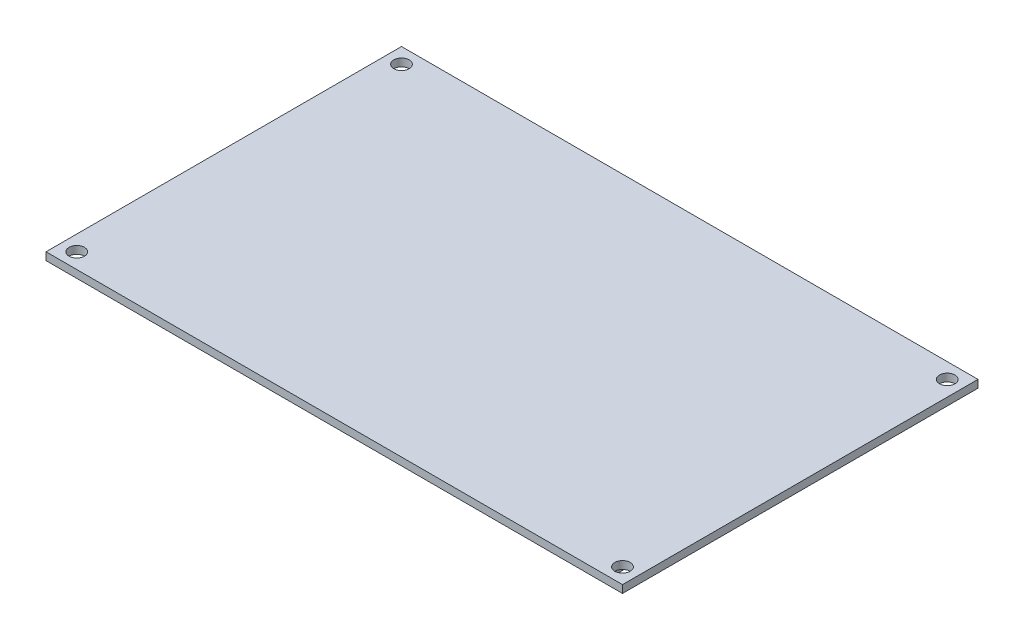
ISO-10303-21;
HEADER;
FILE_DESCRIPTION(('STEP AP214'),'2;1');
FILE_NAME('part.step','',(''),(''),'','','');
FILE_SCHEMA(('AUTOMOTIVE_DESIGN { 1 0 10303 214 1 1 1 1 }'));
ENDSEC;
DATA;
#1=APPLICATION_CONTEXT('core data for automotive mechanical design processes');
#2=APPLICATION_PROTOCOL_DEFINITION('international standard','automotive_design',2000,#1);
#3=PRODUCT_CONTEXT('',#1,'mechanical');
#4=PRODUCT('Part','Part','',(#3));
#5=PRODUCT_RELATED_PRODUCT_CATEGORY('part','',(#4));
#6=PRODUCT_DEFINITION_FORMATION('','',#4);
#7=PRODUCT_DEFINITION_CONTEXT('part definition',#1,'design');
#8=PRODUCT_DEFINITION('design','',#6,#7);
#9=PRODUCT_DEFINITION_SHAPE('','',#8);
#10=(LENGTH_UNIT() NAMED_UNIT(*) SI_UNIT(.MILLI.,.METRE.));
#11=(NAMED_UNIT(*) PLANE_ANGLE_UNIT() SI_UNIT($,.RADIAN.));
#12=(NAMED_UNIT(*) SI_UNIT($,.STERADIAN.) SOLID_ANGLE_UNIT());
#13=UNCERTAINTY_MEASURE_WITH_UNIT(LENGTH_MEASURE(1.E-05),#10,'distance_accuracy_value','');
#14=(GEOMETRIC_REPRESENTATION_CONTEXT(3) GLOBAL_UNCERTAINTY_ASSIGNED_CONTEXT((#13)) GLOBAL_UNIT_ASSIGNED_CONTEXT((#10,
#11,#12)) REPRESENTATION_CONTEXT('',''));
#15=CARTESIAN_POINT('',(0.,0.,0.));
#16=DIRECTION('',(0.,0.,1.));
#17=DIRECTION('',(1.,0.,0.));
#18=AXIS2_PLACEMENT_3D('',#15,#16,#17);
#19=CARTESIAN_POINT('',(0.,0.,0.));
#20=DIRECTION('',(0.,1.,0.));
#21=DIRECTION('',(0.,0.,1.));
#22=AXIS2_PLACEMENT_3D('',#19,#20,#21);
#23=PLANE('',#22);
#24=CARTESIAN_POINT('',(56.8,0.,-33.8));
#25=DIRECTION('',(0.,1.,0.));
#26=DIRECTION('',(0.,0.,-1.));
#27=AXIS2_PLACEMENT_3D('',#24,#25,#26);
#28=CIRCLE('',#27,1.6);
#29=CARTESIAN_POINT('',(56.8,0.,-35.4));
#30=VERTEX_POINT('',#29);
#31=EDGE_CURVE('E119',#30,#30,#28,.T.);
#32=ORIENTED_EDGE('',*,*,#31,.T.);
#33=EDGE_LOOP('',(#32));
#34=FACE_BOUND('',#33,.T.);
#35=CARTESIAN_POINT('',(56.8,0.,33.8));
#36=DIRECTION('',(0.,1.,0.));
#37=DIRECTION('',(0.,0.,1.));
#38=AXIS2_PLACEMENT_3D('',#35,#36,#37);
#39=CIRCLE('',#38,1.6);
#40=CARTESIAN_POINT('',(56.8,0.,35.4));
#41=VERTEX_POINT('',#40);
#42=EDGE_CURVE('E129',#41,#41,#39,.T.);
#43=ORIENTED_EDGE('',*,*,#42,.T.);
#44=EDGE_LOOP('',(#43));
#45=FACE_BOUND('',#44,.T.);
#46=CARTESIAN_POINT('',(-56.8,0.,33.8));
#47=DIRECTION('',(0.,1.,0.));
#48=DIRECTION('',(0.,0.,-1.));
#49=AXIS2_PLACEMENT_3D('',#46,#47,#48);
#50=CIRCLE('',#49,1.6);
#51=CARTESIAN_POINT('',(-56.8,0.,32.2));
#52=VERTEX_POINT('',#51);
#53=EDGE_CURVE('E134',#52,#52,#50,.T.);
#54=ORIENTED_EDGE('',*,*,#53,.T.);
#55=EDGE_LOOP('',(#54));
#56=FACE_BOUND('',#55,.T.);
#57=CARTESIAN_POINT('',(-56.8,0.,-33.8));
#58=DIRECTION('',(0.,1.,0.));
#59=DIRECTION('',(0.,0.,1.));
#60=AXIS2_PLACEMENT_3D('',#57,#58,#59);
#61=CIRCLE('',#60,1.6);
#62=CARTESIAN_POINT('',(-56.8,0.,-32.2));
#63=VERTEX_POINT('',#62);
#64=EDGE_CURVE('E140',#63,#63,#61,.T.);
#65=ORIENTED_EDGE('',*,*,#64,.T.);
#66=EDGE_LOOP('',(#65));
#67=FACE_BOUND('',#66,.T.);
#68=DIRECTION('',(0.,0.,-1.));
#69=VECTOR('',#68,1.);
#70=CARTESIAN_POINT('',(60.,0.,-37.));
#71=LINE('',#70,#69);
#72=CARTESIAN_POINT('',(60.,0.,37.));
#73=VERTEX_POINT('',#72);
#74=CARTESIAN_POINT('',(60.,0.,-37.));
#75=VERTEX_POINT('',#74);
#76=EDGE_CURVE('E146',#73,#75,#71,.T.);
#77=ORIENTED_EDGE('',*,*,#76,.F.);
#78=DIRECTION('',(1.,0.,0.));
#79=VECTOR('',#78,1.);
#80=CARTESIAN_POINT('',(-60.,0.,37.));
#81=LINE('',#80,#79);
#82=CARTESIAN_POINT('',(-60.,0.,37.));
#83=VERTEX_POINT('',#82);
#84=EDGE_CURVE('E153',#83,#73,#81,.T.);
#85=ORIENTED_EDGE('',*,*,#84,.F.);
#86=DIRECTION('',(0.,0.,1.));
#87=VECTOR('',#86,1.);
#88=CARTESIAN_POINT('',(-60.,0.,-37.));
#89=LINE('',#88,#87);
#90=CARTESIAN_POINT('',(-60.,0.,-37.));
#91=VERTEX_POINT('',#90);
#92=EDGE_CURVE('E164',#91,#83,#89,.T.);
#93=ORIENTED_EDGE('',*,*,#92,.F.);
#94=DIRECTION('',(-1.,0.,0.));
#95=VECTOR('',#94,1.);
#96=CARTESIAN_POINT('',(-60.,0.,-37.));
#97=LINE('',#96,#95);
#98=EDGE_CURVE('E162',#75,#91,#97,.T.);
#99=ORIENTED_EDGE('',*,*,#98,.F.);
#100=EDGE_LOOP('',(#77,#85,#93,#99));
#101=FACE_BOUND('',#100,.T.);
#102=DIRECTION('',(0.,0.,-1.));
#103=VECTOR('',#102,1.);
#104=CARTESIAN_POINT('',(-52.75,0.,-33.6));
#105=LINE('',#104,#103);
#106=CARTESIAN_POINT('',(-52.75,0.,33.6));
#107=VERTEX_POINT('',#106);
#108=CARTESIAN_POINT('',(-52.75,0.,-33.6));
#109=VERTEX_POINT('',#108);
#110=EDGE_CURVE('E49',#107,#109,#105,.T.);
#111=ORIENTED_EDGE('',*,*,#110,.F.);
#112=DIRECTION('',(-1.,0.,0.));
#113=VECTOR('',#112,1.);
#114=CARTESIAN_POINT('',(52.75,0.,33.6));
#115=LINE('',#114,#113);
#116=CARTESIAN_POINT('',(52.75,0.,33.6));
#117=VERTEX_POINT('',#116);
#118=EDGE_CURVE('E53',#117,#107,#115,.T.);
#119=ORIENTED_EDGE('',*,*,#118,.F.);
#120=DIRECTION('',(0.,0.,1.));
#121=VECTOR('',#120,1.);
#122=CARTESIAN_POINT('',(52.75,0.,-33.6));
#123=LINE('',#122,#121);
#124=CARTESIAN_POINT('',(52.75,0.,-33.6));
#125=VERTEX_POINT('',#124);
#126=EDGE_CURVE('E330',#125,#117,#123,.T.);
#127=ORIENTED_EDGE('',*,*,#126,.F.);
#128=DIRECTION('',(1.,0.,0.));
#129=VECTOR('',#128,1.);
#130=CARTESIAN_POINT('',(52.75,0.,-33.6));
#131=LINE('',#130,#129);
#132=EDGE_CURVE('E336',#109,#125,#131,.T.);
#133=ORIENTED_EDGE('',*,*,#132,.F.);
#134=EDGE_LOOP('',(#111,#119,#127,#133));
#135=FACE_BOUND('',#134,.T.);
#136=ADVANCED_FACE('F34',(#34,#45,#56,#67,#101,#135),#23,.F.);
#137=CARTESIAN_POINT('',(0.,1.6,0.));
#138=DIRECTION('',(0.,1.,0.));
#139=DIRECTION('',(0.,0.,1.));
#140=AXIS2_PLACEMENT_3D('',#137,#138,#139);
#141=PLANE('',#140);
#142=CARTESIAN_POINT('',(56.8,1.6,33.8));
#143=DIRECTION('',(0.,1.,0.));
#144=DIRECTION('',(0.,0.,1.));
#145=AXIS2_PLACEMENT_3D('',#142,#143,#144);
#146=CIRCLE('',#145,1.6);
#147=CARTESIAN_POINT('',(56.8,1.6,35.4));
#148=VERTEX_POINT('',#147);
#149=EDGE_CURVE('E131',#148,#148,#146,.T.);
#150=ORIENTED_EDGE('',*,*,#149,.F.);
#151=EDGE_LOOP('',(#150));
#152=FACE_BOUND('',#151,.T.);
#153=CARTESIAN_POINT('',(-56.8,1.6,-33.8));
#154=DIRECTION('',(0.,1.,0.));
#155=DIRECTION('',(0.,0.,1.));
#156=AXIS2_PLACEMENT_3D('',#153,#154,#155);
#157=CIRCLE('',#156,1.6);
#158=CARTESIAN_POINT('',(-56.8,1.6,-32.2));
#159=VERTEX_POINT('',#158);
#160=EDGE_CURVE('E143',#159,#159,#157,.T.);
#161=ORIENTED_EDGE('',*,*,#160,.F.);
#162=EDGE_LOOP('',(#161));
#163=FACE_BOUND('',#162,.T.);
#164=DIRECTION('',(0.,0.,-1.));
#165=VECTOR('',#164,1.);
#166=CARTESIAN_POINT('',(60.,1.6,-37.));
#167=LINE('',#166,#165);
#168=CARTESIAN_POINT('',(60.,1.6,37.));
#169=VERTEX_POINT('',#168);
#170=CARTESIAN_POINT('',(60.,1.6,-37.));
#171=VERTEX_POINT('',#170);
#172=EDGE_CURVE('E149',#169,#171,#167,.T.);
#173=ORIENTED_EDGE('',*,*,#172,.T.);
#174=DIRECTION('',(-1.,0.,0.));
#175=VECTOR('',#174,1.);
#176=CARTESIAN_POINT('',(-60.,1.6,-37.));
#177=LINE('',#176,#175);
#178=CARTESIAN_POINT('',(-60.,1.6,-37.));
#179=VERTEX_POINT('',#178);
#180=EDGE_CURVE('E152',#171,#179,#177,.T.);
#181=ORIENTED_EDGE('',*,*,#180,.T.);
#182=DIRECTION('',(0.,0.,1.));
#183=VECTOR('',#182,1.);
#184=CARTESIAN_POINT('',(-60.,1.6,-37.));
#185=LINE('',#184,#183);
#186=CARTESIAN_POINT('',(-60.,1.6,37.));
#187=VERTEX_POINT('',#186);
#188=EDGE_CURVE('E155',#179,#187,#185,.T.);
#189=ORIENTED_EDGE('',*,*,#188,.T.);
#190=DIRECTION('',(1.,0.,0.));
#191=VECTOR('',#190,1.);
#192=CARTESIAN_POINT('',(-60.,1.6,37.));
#193=LINE('',#192,#191);
#194=EDGE_CURVE('E157',#187,#169,#193,.T.);
#195=ORIENTED_EDGE('',*,*,#194,.T.);
#196=EDGE_LOOP('',(#173,#181,#189,#195));
#197=FACE_BOUND('',#196,.T.);
#198=CARTESIAN_POINT('',(-56.8,1.6,33.8));
#199=DIRECTION('',(0.,1.,0.));
#200=DIRECTION('',(0.,0.,-1.));
#201=AXIS2_PLACEMENT_3D('',#198,#199,#200);
#202=CIRCLE('',#201,1.6);
#203=CARTESIAN_POINT('',(-56.8,1.6,32.2));
#204=VERTEX_POINT('',#203);
#205=EDGE_CURVE('E137',#204,#204,#202,.T.);
#206=ORIENTED_EDGE('',*,*,#205,.F.);
#207=EDGE_LOOP('',(#206));
#208=FACE_BOUND('',#207,.T.);
#209=CARTESIAN_POINT('',(56.8,1.6,-33.8));
#210=DIRECTION('',(0.,1.,0.));
#211=DIRECTION('',(0.,0.,-1.));
#212=AXIS2_PLACEMENT_3D('',#209,#210,#211);
#213=CIRCLE('',#212,1.6);
#214=CARTESIAN_POINT('',(56.8,1.6,-35.4));
#215=VERTEX_POINT('',#214);
#216=EDGE_CURVE('E122',#215,#215,#213,.T.);
#217=ORIENTED_EDGE('',*,*,#216,.F.);
#218=EDGE_LOOP('',(#217));
#219=FACE_BOUND('',#218,.T.);
#220=ADVANCED_FACE('F190',(#152,#163,#197,#208,#219),#141,.T.);
#221=CARTESIAN_POINT('',(60.,1.6,-37.));
#222=DIRECTION('',(-1.,0.,0.));
#223=DIRECTION('',(0.,0.,1.));
#224=AXIS2_PLACEMENT_3D('',#221,#222,#223);
#225=PLANE('',#224);
#226=ORIENTED_EDGE('',*,*,#76,.T.);
#227=DIRECTION('',(0.,-1.,0.));
#228=VECTOR('',#227,1.);
#229=CARTESIAN_POINT('',(60.,1.6,-37.));
#230=LINE('',#229,#228);
#231=EDGE_CURVE('E11',#171,#75,#230,.T.);
#232=ORIENTED_EDGE('',*,*,#231,.F.);
#233=ORIENTED_EDGE('',*,*,#172,.F.);
#234=DIRECTION('',(0.,-1.,0.));
#235=VECTOR('',#234,1.);
#236=CARTESIAN_POINT('',(60.,1.6,37.));
#237=LINE('',#236,#235);
#238=EDGE_CURVE('E159',#169,#73,#237,.T.);
#239=ORIENTED_EDGE('',*,*,#238,.T.);
#240=EDGE_LOOP('',(#226,#232,#233,#239));
#241=FACE_BOUND('',#240,.T.);
#242=ADVANCED_FACE('F36',(#241),#225,.F.);
#243=CARTESIAN_POINT('',(-60.,1.6,-37.));
#244=DIRECTION('',(0.,0.,1.));
#245=DIRECTION('',(1.,0.,0.));
#246=AXIS2_PLACEMENT_3D('',#243,#244,#245);
#247=PLANE('',#246);
#248=ORIENTED_EDGE('',*,*,#98,.T.);
#249=DIRECTION('',(0.,-1.,0.));
#250=VECTOR('',#249,1.);
#251=CARTESIAN_POINT('',(-60.,1.6,-37.));
#252=LINE('',#251,#250);
#253=EDGE_CURVE('E42',#179,#91,#252,.T.);
#254=ORIENTED_EDGE('',*,*,#253,.F.);
#255=ORIENTED_EDGE('',*,*,#180,.F.);
#256=ORIENTED_EDGE('',*,*,#231,.T.);
#257=EDGE_LOOP('',(#248,#254,#255,#256));
#258=FACE_BOUND('',#257,.T.);
#259=ADVANCED_FACE('F192',(#258),#247,.F.);
#260=CARTESIAN_POINT('',(-60.,1.6,-37.));
#261=DIRECTION('',(1.,0.,0.));
#262=DIRECTION('',(0.,0.,-1.));
#263=AXIS2_PLACEMENT_3D('',#260,#261,#262);
#264=PLANE('',#263);
#265=ORIENTED_EDGE('',*,*,#92,.T.);
#266=DIRECTION('',(0.,-1.,0.));
#267=VECTOR('',#266,1.);
#268=CARTESIAN_POINT('',(-60.,1.6,37.));
#269=LINE('',#268,#267);
#270=EDGE_CURVE('E169',#187,#83,#269,.T.);
#271=ORIENTED_EDGE('',*,*,#270,.F.);
#272=ORIENTED_EDGE('',*,*,#188,.F.);
#273=ORIENTED_EDGE('',*,*,#253,.T.);
#274=EDGE_LOOP('',(#265,#271,#272,#273));
#275=FACE_BOUND('',#274,.T.);
#276=ADVANCED_FACE('F176',(#275),#264,.F.);
#277=CARTESIAN_POINT('',(-60.,1.6,37.));
#278=DIRECTION('',(0.,0.,-1.));
#279=DIRECTION('',(-1.,0.,0.));
#280=AXIS2_PLACEMENT_3D('',#277,#278,#279);
#281=PLANE('',#280);
#282=ORIENTED_EDGE('',*,*,#84,.T.);
#283=ORIENTED_EDGE('',*,*,#238,.F.);
#284=ORIENTED_EDGE('',*,*,#194,.F.);
#285=ORIENTED_EDGE('',*,*,#270,.T.);
#286=EDGE_LOOP('',(#282,#283,#284,#285));
#287=FACE_BOUND('',#286,.T.);
#288=ADVANCED_FACE('F184',(#287),#281,.F.);
#289=CARTESIAN_POINT('',(-56.8,1.6,-33.8));
#290=DIRECTION('',(0.,-1.,0.));
#291=DIRECTION('',(0.,0.,-1.));
#292=AXIS2_PLACEMENT_3D('',#289,#290,#291);
#293=CYLINDRICAL_SURFACE('',#292,1.6);
#294=ORIENTED_EDGE('',*,*,#160,.T.);
#295=EDGE_LOOP('',(#294));
#296=FACE_BOUND('',#295,.T.);
#297=ORIENTED_EDGE('',*,*,#64,.F.);
#298=EDGE_LOOP('',(#297));
#299=FACE_BOUND('',#298,.T.);
#300=ADVANCED_FACE('F211',(#296,#299),#293,.F.);
#301=CARTESIAN_POINT('',(-56.8,1.6,33.8));
#302=DIRECTION('',(0.,-1.,0.));
#303=DIRECTION('',(0.,0.,-1.));
#304=AXIS2_PLACEMENT_3D('',#301,#302,#303);
#305=CYLINDRICAL_SURFACE('',#304,1.6);
#306=ORIENTED_EDGE('',*,*,#205,.T.);
#307=EDGE_LOOP('',(#306));
#308=FACE_BOUND('',#307,.T.);
#309=ORIENTED_EDGE('',*,*,#53,.F.);
#310=EDGE_LOOP('',(#309));
#311=FACE_BOUND('',#310,.T.);
#312=ADVANCED_FACE('F215',(#308,#311),#305,.F.);
#313=CARTESIAN_POINT('',(56.8,1.6,33.8));
#314=DIRECTION('',(0.,-1.,0.));
#315=DIRECTION('',(0.,0.,-1.));
#316=AXIS2_PLACEMENT_3D('',#313,#314,#315);
#317=CYLINDRICAL_SURFACE('',#316,1.6);
#318=ORIENTED_EDGE('',*,*,#149,.T.);
#319=EDGE_LOOP('',(#318));
#320=FACE_BOUND('',#319,.T.);
#321=ORIENTED_EDGE('',*,*,#42,.F.);
#322=EDGE_LOOP('',(#321));
#323=FACE_BOUND('',#322,.T.);
#324=ADVANCED_FACE('F220',(#320,#323),#317,.F.);
#325=CARTESIAN_POINT('',(56.8,1.6,-33.8));
#326=DIRECTION('',(0.,-1.,0.));
#327=DIRECTION('',(0.,0.,-1.));
#328=AXIS2_PLACEMENT_3D('',#325,#326,#327);
#329=CYLINDRICAL_SURFACE('',#328,1.6);
#330=ORIENTED_EDGE('',*,*,#216,.T.);
#331=EDGE_LOOP('',(#330));
#332=FACE_BOUND('',#331,.T.);
#333=ORIENTED_EDGE('',*,*,#31,.F.);
#334=EDGE_LOOP('',(#333));
#335=FACE_BOUND('',#334,.T.);
#336=ADVANCED_FACE('F227',(#332,#335),#329,.F.);
#337=CARTESIAN_POINT('',(-52.75,-3.1,-33.6));
#338=DIRECTION('',(1.,0.,0.));
#339=DIRECTION('',(0.,0.,-1.));
#340=AXIS2_PLACEMENT_3D('',#337,#338,#339);
#341=PLANE('',#340);
#342=ORIENTED_EDGE('',*,*,#110,.T.);
#343=DIRECTION('',(0.,1.,0.));
#344=VECTOR('',#343,1.);
#345=CARTESIAN_POINT('',(-52.75,-3.1,-33.6));
#346=LINE('',#345,#344);
#347=CARTESIAN_POINT('',(-52.75,-3.1,-33.6));
#348=VERTEX_POINT('',#347);
#349=EDGE_CURVE('E102',#348,#109,#346,.T.);
#350=ORIENTED_EDGE('',*,*,#349,.F.);
#351=DIRECTION('',(0.,0.,-1.));
#352=VECTOR('',#351,1.);
#353=CARTESIAN_POINT('',(-52.75,-3.1,-33.6));
#354=LINE('',#353,#352);
#355=CARTESIAN_POINT('',(-52.75,-3.1,33.6));
#356=VERTEX_POINT('',#355);
#357=EDGE_CURVE('E108',#356,#348,#354,.T.);
#358=ORIENTED_EDGE('',*,*,#357,.F.);
#359=DIRECTION('',(0.,1.,0.));
#360=VECTOR('',#359,1.);
#361=CARTESIAN_POINT('',(-52.75,-3.1,33.6));
#362=LINE('',#361,#360);
#363=EDGE_CURVE('E328',#356,#107,#362,.T.);
#364=ORIENTED_EDGE('',*,*,#363,.T.);
#365=EDGE_LOOP('',(#342,#350,#358,#364));
#366=FACE_BOUND('',#365,.T.);
#367=ADVANCED_FACE('F118',(#366),#341,.F.);
#368=CARTESIAN_POINT('',(52.75,-3.1,-33.6));
#369=DIRECTION('',(0.,0.,1.));
#370=DIRECTION('',(1.,0.,0.));
#371=AXIS2_PLACEMENT_3D('',#368,#369,#370);
#372=PLANE('',#371);
#373=ORIENTED_EDGE('',*,*,#132,.T.);
#374=DIRECTION('',(0.,1.,0.));
#375=VECTOR('',#374,1.);
#376=CARTESIAN_POINT('',(52.75,-3.1,-33.6));
#377=LINE('',#376,#375);
#378=CARTESIAN_POINT('',(52.75,-3.1,-33.6));
#379=VERTEX_POINT('',#378);
#380=EDGE_CURVE('E104',#379,#125,#377,.T.);
#381=ORIENTED_EDGE('',*,*,#380,.F.);
#382=DIRECTION('',(1.,0.,0.));
#383=VECTOR('',#382,1.);
#384=CARTESIAN_POINT('',(52.75,-3.1,-33.6));
#385=LINE('',#384,#383);
#386=EDGE_CURVE('E97',#348,#379,#385,.T.);
#387=ORIENTED_EDGE('',*,*,#386,.F.);
#388=ORIENTED_EDGE('',*,*,#349,.T.);
#389=EDGE_LOOP('',(#373,#381,#387,#388));
#390=FACE_BOUND('',#389,.T.);
#391=ADVANCED_FACE('F100',(#390),#372,.F.);
#392=CARTESIAN_POINT('',(52.75,-3.1,-33.6));
#393=DIRECTION('',(-1.,0.,0.));
#394=DIRECTION('',(0.,0.,1.));
#395=AXIS2_PLACEMENT_3D('',#392,#393,#394);
#396=PLANE('',#395);
#397=ORIENTED_EDGE('',*,*,#126,.T.);
#398=DIRECTION('',(0.,1.,0.));
#399=VECTOR('',#398,1.);
#400=CARTESIAN_POINT('',(52.75,-3.1,33.6));
#401=LINE('',#400,#399);
#402=CARTESIAN_POINT('',(52.75,-3.1,33.6));
#403=VERTEX_POINT('',#402);
#404=EDGE_CURVE('E124',#403,#117,#401,.T.);
#405=ORIENTED_EDGE('',*,*,#404,.F.);
#406=DIRECTION('',(0.,0.,1.));
#407=VECTOR('',#406,1.);
#408=CARTESIAN_POINT('',(52.75,-3.1,-33.6));
#409=LINE('',#408,#407);
#410=EDGE_CURVE('E107',#379,#403,#409,.T.);
#411=ORIENTED_EDGE('',*,*,#410,.F.);
#412=ORIENTED_EDGE('',*,*,#380,.T.);
#413=EDGE_LOOP('',(#397,#405,#411,#412));
#414=FACE_BOUND('',#413,.T.);
#415=ADVANCED_FACE('F236',(#414),#396,.F.);
#416=CARTESIAN_POINT('',(52.75,-3.1,33.6));
#417=DIRECTION('',(0.,0.,-1.));
#418=DIRECTION('',(-1.,0.,0.));
#419=AXIS2_PLACEMENT_3D('',#416,#417,#418);
#420=PLANE('',#419);
#421=ORIENTED_EDGE('',*,*,#118,.T.);
#422=ORIENTED_EDGE('',*,*,#363,.F.);
#423=DIRECTION('',(-1.,0.,0.));
#424=VECTOR('',#423,1.);
#425=CARTESIAN_POINT('',(52.75,-3.1,33.6));
#426=LINE('',#425,#424);
#427=EDGE_CURVE('E113',#403,#356,#426,.T.);
#428=ORIENTED_EDGE('',*,*,#427,.F.);
#429=ORIENTED_EDGE('',*,*,#404,.T.);
#430=EDGE_LOOP('',(#421,#422,#428,#429));
#431=FACE_BOUND('',#430,.T.);
#432=ADVANCED_FACE('F239',(#431),#420,.F.);
#433=CARTESIAN_POINT('',(0.,-3.1,0.));
#434=DIRECTION('',(0.,-1.,0.));
#435=DIRECTION('',(0.,0.,-1.));
#436=AXIS2_PLACEMENT_3D('',#433,#434,#435);
#437=PLANE('',#436);
#438=ORIENTED_EDGE('',*,*,#357,.T.);
#439=ORIENTED_EDGE('',*,*,#386,.T.);
#440=ORIENTED_EDGE('',*,*,#410,.T.);
#441=ORIENTED_EDGE('',*,*,#427,.T.);
#442=EDGE_LOOP('',(#438,#439,#440,#441));
#443=FACE_BOUND('',#442,.T.);
#444=ADVANCED_FACE('F111',(#443),#437,.T.);
#445=CLOSED_SHELL('',(#136,#220,#242,#259,#276,#288,#300,#312,#324,#336,#367,#391,#415,#432,#444));
#446=MANIFOLD_SOLID_BREP('B2',#445);
#447=ADVANCED_BREP_SHAPE_REPRESENTATION('',(#18,#446),#14);
#448=SHAPE_DEFINITION_REPRESENTATION(#9,#447);
ENDSEC;
END-ISO-10303-21;
